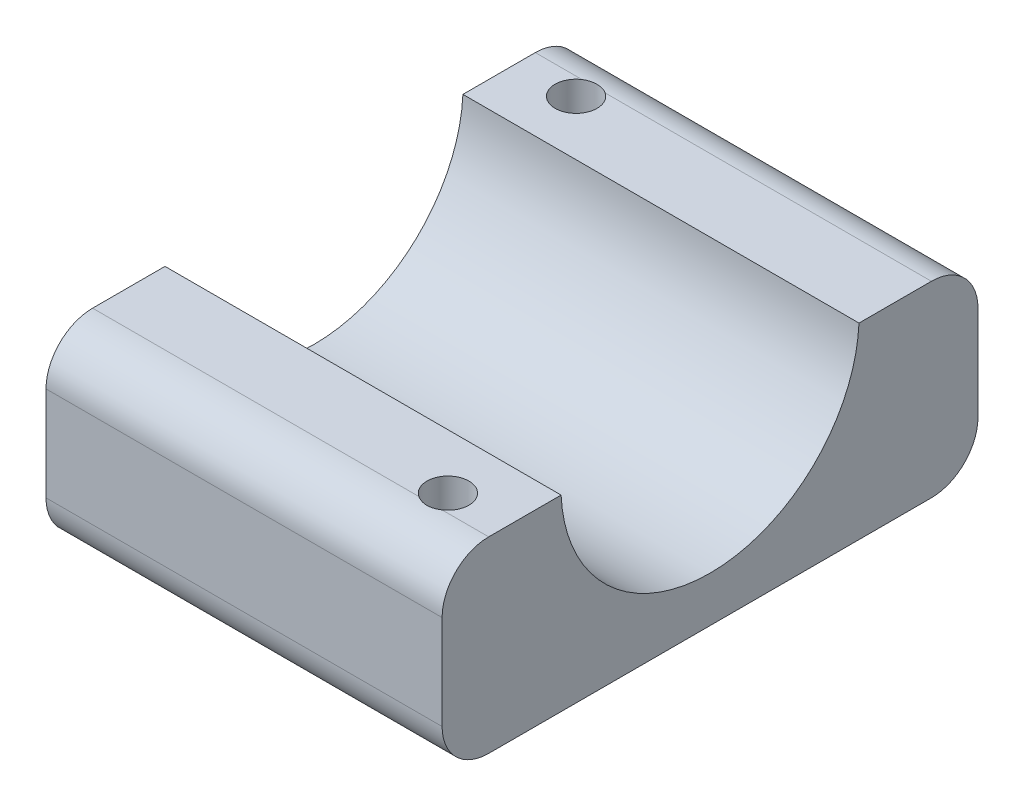
ISO-10303-21;
HEADER;
FILE_DESCRIPTION(('STEP AP214'),'2;1');
FILE_NAME('part.step','',(''),(''),'','','');
FILE_SCHEMA(('AUTOMOTIVE_DESIGN { 1 0 10303 214 1 1 1 1 }'));
ENDSEC;
DATA;
#1=APPLICATION_CONTEXT('core data for automotive mechanical design processes');
#2=APPLICATION_PROTOCOL_DEFINITION('international standard','automotive_design',2000,#1);
#3=PRODUCT_CONTEXT('',#1,'mechanical');
#4=PRODUCT('Part','Part','',(#3));
#5=PRODUCT_RELATED_PRODUCT_CATEGORY('part','',(#4));
#6=PRODUCT_DEFINITION_FORMATION('','',#4);
#7=PRODUCT_DEFINITION_CONTEXT('part definition',#1,'design');
#8=PRODUCT_DEFINITION('design','',#6,#7);
#9=PRODUCT_DEFINITION_SHAPE('','',#8);
#10=(LENGTH_UNIT() NAMED_UNIT(*) SI_UNIT(.MILLI.,.METRE.));
#11=(NAMED_UNIT(*) PLANE_ANGLE_UNIT() SI_UNIT($,.RADIAN.));
#12=(NAMED_UNIT(*) SI_UNIT($,.STERADIAN.) SOLID_ANGLE_UNIT());
#13=UNCERTAINTY_MEASURE_WITH_UNIT(LENGTH_MEASURE(1.E-05),#10,'distance_accuracy_value','');
#14=(GEOMETRIC_REPRESENTATION_CONTEXT(3) GLOBAL_UNCERTAINTY_ASSIGNED_CONTEXT((#13)) GLOBAL_UNIT_ASSIGNED_CONTEXT((#10,
#11,#12)) REPRESENTATION_CONTEXT('',''));
#15=CARTESIAN_POINT('',(0.,0.,0.));
#16=DIRECTION('',(0.,0.,1.));
#17=DIRECTION('',(1.,0.,0.));
#18=AXIS2_PLACEMENT_3D('',#15,#16,#17);
#19=CARTESIAN_POINT('',(17.,-12.7,19.));
#20=DIRECTION('',(-1.,0.,0.));
#21=DIRECTION('',(0.,0.,1.));
#22=AXIS2_PLACEMENT_3D('',#19,#20,#21);
#23=CYLINDRICAL_SURFACE('',#22,4.);
#24=CARTESIAN_POINT('',(14.8831406486677,-16.7,19.));
#25=CARTESIAN_POINT('',(14.8426506773485,-16.7000109242073,19.0778574955817));
#26=CARTESIAN_POINT('',(14.799000228987,-16.6977274477931,19.1540259495156));
#27=CARTESIAN_POINT('',(14.7058465588756,-16.6892434582838,19.3023684001236));
#28=CARTESIAN_POINT('',(14.6563491198335,-16.6830467894245,19.3745462414952));
#29=CARTESIAN_POINT('',(14.5521394497937,-16.6674431467714,19.5141099444437));
#30=CARTESIAN_POINT('',(14.4974534105728,-16.6580517369091,19.5815171592083));
#31=CARTESIAN_POINT('',(14.3830963067864,-16.6367588944703,19.7115277345354));
#32=CARTESIAN_POINT('',(14.3234240657577,-16.624856868514,19.7741299546666));
#33=CARTESIAN_POINT('',(14.137958520912,-16.5865410499203,19.9538040445996));
#34=CARTESIAN_POINT('',(14.0052730523629,-16.5574402181653,20.063333735106));
#35=CARTESIAN_POINT('',(13.7244267415197,-16.4977204142456,20.2601369098951));
#36=CARTESIAN_POINT('',(13.576240301189,-16.4670989762058,20.3473727339024));
#37=CARTESIAN_POINT('',(13.2554948894781,-16.4077377901675,20.5033912591476));
#38=CARTESIAN_POINT('',(13.0819397555766,-16.3793171325302,20.5702714707651));
#39=CARTESIAN_POINT('',(12.7247230253625,-16.3334988458983,20.67360310912));
#40=CARTESIAN_POINT('',(12.541074540201,-16.3160872676328,20.7100930611152));
#41=CARTESIAN_POINT('',(12.1801211742974,-16.2970438866187,20.7497826168194));
#42=CARTESIAN_POINT('',(12.0030606959685,-16.2945604785481,20.7547796461988));
#43=CARTESIAN_POINT('',(11.6508551478767,-16.303665315988,20.7360004114565));
#44=CARTESIAN_POINT('',(11.4757100720865,-16.3152535172044,20.7122242379062));
#45=CARTESIAN_POINT('',(11.1432131791046,-16.3488250161309,20.6393688950356));
#46=CARTESIAN_POINT('',(10.9854273142967,-16.3701323340066,20.5919187162139));
#47=CARTESIAN_POINT('',(10.6795530268689,-16.4189794615007,20.4741906823131));
#48=CARTESIAN_POINT('',(10.5314732871055,-16.4465247559277,20.4038927142524));
#49=CARTESIAN_POINT('',(10.2349555579031,-16.5058026088642,20.2347450945025));
#50=CARTESIAN_POINT('',(10.0876893410615,-16.5376887696085,20.13389244722));
#51=CARTESIAN_POINT('',(9.81126908660816,-16.5970581196079,19.9090688065648));
#52=CARTESIAN_POINT('',(9.68208622636505,-16.624548325662,19.7851353533026));
#53=CARTESIAN_POINT('',(9.4767689193668,-16.6629034475965,19.5525613074241));
#54=CARTESIAN_POINT('',(9.39568604242196,-16.6762483146135,19.4486923027872));
#55=CARTESIAN_POINT('',(9.28369159763862,-16.6901621549613,19.2856467872631));
#56=CARTESIAN_POINT('',(9.24792841576943,-16.6937835167149,19.2300209908782));
#57=CARTESIAN_POINT('',(9.17979814905551,-16.6987044935031,19.1165845685182));
#58=CARTESIAN_POINT('',(9.14743311817267,-16.7000027118666,19.058772649559));
#59=CARTESIAN_POINT('',(9.1168593513323,-16.7,19.));
#60=B_SPLINE_CURVE_WITH_KNOTS('',3,(#24,#25,#26,#27,#28,#29,#30,#31,#32,#33,#34,#35,#36,#37,#38,
#39,#40,#41,#42,#43,#44,#45,#46,#47,#48,#49,#50,#51,#52,#53,#54,#55,#56,#57,#58,#59),
.UNSPECIFIED.,.F.,.F.,(4,2,2,2,2,2,2,2,2,2,2,2,2,2,2,2,2,4),(0.,0.263108350436764,
0.525958630143497,0.78754628825429,1.0491958415726,1.5702947033418,2.09226810629026,
2.65384856233941,3.21471602330402,3.74325888086913,4.27180007470835,4.76815579490835,
5.26494964749648,5.80654118475775,6.34725941618147,6.7433968577492,6.94193709517688,
7.140596654703),.UNSPECIFIED.);
#61=CARTESIAN_POINT('',(14.8831406486677,-16.7,19.));
#62=VERTEX_POINT('',#61);
#63=CARTESIAN_POINT('',(9.1168593513323,-16.7,19.));
#64=VERTEX_POINT('',#63);
#65=EDGE_CURVE('E62',#62,#64,#60,.T.);
#66=ORIENTED_EDGE('',*,*,#65,.F.);
#67=DIRECTION('',(-1.,0.,0.));
#68=VECTOR('',#67,1.);
#69=CARTESIAN_POINT('',(17.,-16.7,19.));
#70=LINE('',#69,#68);
#71=CARTESIAN_POINT('',(17.,-16.7,19.));
#72=VERTEX_POINT('',#71);
#73=EDGE_CURVE('E166',#72,#62,#70,.T.);
#74=ORIENTED_EDGE('',*,*,#73,.F.);
#75=CARTESIAN_POINT('',(17.,-12.7,19.));
#76=DIRECTION('',(1.,0.,0.));
#77=DIRECTION('',(0.,0.,-1.));
#78=AXIS2_PLACEMENT_3D('',#75,#76,#77);
#79=CIRCLE('',#78,4.);
#80=CARTESIAN_POINT('',(17.,-12.7,23.));
#81=VERTEX_POINT('',#80);
#82=EDGE_CURVE('E235',#81,#72,#79,.T.);
#83=ORIENTED_EDGE('',*,*,#82,.F.);
#84=DIRECTION('',(-1.,0.,0.));
#85=VECTOR('',#84,1.);
#86=CARTESIAN_POINT('',(17.,-12.7,23.));
#87=LINE('',#86,#85);
#88=CARTESIAN_POINT('',(-17.,-12.7,23.));
#89=VERTEX_POINT('',#88);
#90=EDGE_CURVE('E262',#81,#89,#87,.T.);
#91=ORIENTED_EDGE('',*,*,#90,.T.);
#92=CARTESIAN_POINT('',(-17.,-12.7,19.));
#93=DIRECTION('',(1.,0.,0.));
#94=DIRECTION('',(0.,0.,-1.));
#95=AXIS2_PLACEMENT_3D('',#92,#93,#94);
#96=CIRCLE('',#95,4.);
#97=CARTESIAN_POINT('',(-17.,-16.7,19.));
#98=VERTEX_POINT('',#97);
#99=EDGE_CURVE('E263',#89,#98,#96,.T.);
#100=ORIENTED_EDGE('',*,*,#99,.T.);
#101=EDGE_CURVE('E160',#64,#98,#70,.T.);
#102=ORIENTED_EDGE('',*,*,#101,.F.);
#103=EDGE_LOOP('',(#66,#74,#83,#91,#100,#102));
#104=FACE_BOUND('',#103,.T.);
#105=ADVANCED_FACE('F39',(#104),#23,.T.);
#106=CARTESIAN_POINT('',(17.,-12.7,-19.));
#107=DIRECTION('',(-1.,0.,0.));
#108=DIRECTION('',(0.,0.,1.));
#109=AXIS2_PLACEMENT_3D('',#106,#107,#108);
#110=CYLINDRICAL_SURFACE('',#109,4.);
#111=CARTESIAN_POINT('',(-14.8831406486677,-16.7,-19.));
#112=CARTESIAN_POINT('',(-14.8426506773485,-16.7000109242073,-19.0778574955817));
#113=CARTESIAN_POINT('',(-14.799000228987,-16.6977274477931,-19.1540259495156));
#114=CARTESIAN_POINT('',(-14.7058465588756,-16.6892434582838,-19.3023684001236));
#115=CARTESIAN_POINT('',(-14.6563491198335,-16.6830467894245,-19.3745462414952));
#116=CARTESIAN_POINT('',(-14.5521394497937,-16.6674431467714,-19.5141099444437));
#117=CARTESIAN_POINT('',(-14.4974534105728,-16.6580517369091,-19.5815171592083));
#118=CARTESIAN_POINT('',(-14.3830963067865,-16.6367588944703,-19.7115277345354));
#119=CARTESIAN_POINT('',(-14.3234240657577,-16.624856868514,-19.7741299546666));
#120=CARTESIAN_POINT('',(-14.137958520912,-16.5865410499203,-19.9538040445996));
#121=CARTESIAN_POINT('',(-14.0052730523629,-16.5574402181653,-20.063333735106));
#122=CARTESIAN_POINT('',(-13.7244267415197,-16.4977204142456,-20.2601369098951));
#123=CARTESIAN_POINT('',(-13.576240301189,-16.4670989762058,-20.3473727339024));
#124=CARTESIAN_POINT('',(-13.2554948894781,-16.4077377901675,-20.5033912591476));
#125=CARTESIAN_POINT('',(-13.0819397555766,-16.3793171325302,-20.5702714707651));
#126=CARTESIAN_POINT('',(-12.7247230253625,-16.3334988458983,-20.67360310912));
#127=CARTESIAN_POINT('',(-12.541074540201,-16.3160872676328,-20.7100930611152));
#128=CARTESIAN_POINT('',(-12.1801211742974,-16.2970438866187,-20.7497826168194));
#129=CARTESIAN_POINT('',(-12.0030606959685,-16.2945604785481,-20.7547796461988));
#130=CARTESIAN_POINT('',(-11.6508551478767,-16.303665315988,-20.7360004114565));
#131=CARTESIAN_POINT('',(-11.4757100720865,-16.3152535172044,-20.7122242379062));
#132=CARTESIAN_POINT('',(-11.1432131791046,-16.3488250161309,-20.6393688950356));
#133=CARTESIAN_POINT('',(-10.9854273142967,-16.3701323340066,-20.5919187162139));
#134=CARTESIAN_POINT('',(-10.6795530268689,-16.4189794615007,-20.4741906823131));
#135=CARTESIAN_POINT('',(-10.5314732871055,-16.4465247559277,-20.4038927142524));
#136=CARTESIAN_POINT('',(-10.2349555579031,-16.5058026088642,-20.2347450945025));
#137=CARTESIAN_POINT('',(-10.0876893410615,-16.5376887696085,-20.13389244722));
#138=CARTESIAN_POINT('',(-9.81126908660815,-16.5970581196079,-19.9090688065648));
#139=CARTESIAN_POINT('',(-9.68208622636505,-16.624548325662,-19.7851353533026));
#140=CARTESIAN_POINT('',(-9.4767689193668,-16.6629034475965,-19.5525613074241));
#141=CARTESIAN_POINT('',(-9.39568604242196,-16.6762483146135,-19.4486923027872));
#142=CARTESIAN_POINT('',(-9.28369159763862,-16.6901621549613,-19.2856467872631));
#143=CARTESIAN_POINT('',(-9.24792841576943,-16.6937835167149,-19.2300209908782));
#144=CARTESIAN_POINT('',(-9.17979814905551,-16.6987044935031,-19.1165845685183));
#145=CARTESIAN_POINT('',(-9.14743311817267,-16.7000027118666,-19.058772649559));
#146=CARTESIAN_POINT('',(-9.1168593513323,-16.7,-19.));
#147=B_SPLINE_CURVE_WITH_KNOTS('',3,(#111,#112,#113,#114,#115,#116,#117,#118,#119,#120,#121,
#122,#123,#124,#125,#126,#127,#128,#129,#130,#131,#132,#133,#134,#135,#136,#137,#138,#139,#140,
#141,#142,#143,#144,#145,#146),.UNSPECIFIED.,.F.,.F.,(4,2,2,2,2,2,2,2,2,2,2,2,2,2,2,2,2,4),(0.,
0.263108350436761,0.525958630143496,0.787546288254289,1.0491958415726,1.57029470334181,
2.09226810629026,2.65384856233941,3.21471602330402,3.74325888086914,4.27180007470836,
4.76815579490835,5.26494964749648,5.80654118475775,6.34725941618148,6.74339685774921,
6.94193709517688,7.140596654703),.UNSPECIFIED.);
#148=CARTESIAN_POINT('',(-14.8831406486677,-16.7,-19.));
#149=VERTEX_POINT('',#148);
#150=CARTESIAN_POINT('',(-9.1168593513323,-16.7,-19.));
#151=VERTEX_POINT('',#150);
#152=EDGE_CURVE('E55',#149,#151,#147,.T.);
#153=ORIENTED_EDGE('',*,*,#152,.F.);
#154=DIRECTION('',(-1.,0.,0.));
#155=VECTOR('',#154,1.);
#156=CARTESIAN_POINT('',(17.,-16.7,-19.));
#157=LINE('',#156,#155);
#158=CARTESIAN_POINT('',(-17.,-16.7,-19.));
#159=VERTEX_POINT('',#158);
#160=EDGE_CURVE('E149',#149,#159,#157,.T.);
#161=ORIENTED_EDGE('',*,*,#160,.T.);
#162=CARTESIAN_POINT('',(-17.,-12.7,-19.));
#163=DIRECTION('',(1.,0.,0.));
#164=DIRECTION('',(0.,0.,-1.));
#165=AXIS2_PLACEMENT_3D('',#162,#163,#164);
#166=CIRCLE('',#165,4.);
#167=CARTESIAN_POINT('',(-17.,-12.7,-23.));
#168=VERTEX_POINT('',#167);
#169=EDGE_CURVE('E266',#159,#168,#166,.T.);
#170=ORIENTED_EDGE('',*,*,#169,.T.);
#171=DIRECTION('',(-1.,0.,0.));
#172=VECTOR('',#171,1.);
#173=CARTESIAN_POINT('',(17.,-12.7,-23.));
#174=LINE('',#173,#172);
#175=CARTESIAN_POINT('',(17.,-12.7,-23.));
#176=VERTEX_POINT('',#175);
#177=EDGE_CURVE('E158',#176,#168,#174,.T.);
#178=ORIENTED_EDGE('',*,*,#177,.F.);
#179=CARTESIAN_POINT('',(17.,-12.7,-19.));
#180=DIRECTION('',(1.,0.,0.));
#181=DIRECTION('',(0.,0.,-1.));
#182=AXIS2_PLACEMENT_3D('',#179,#180,#181);
#183=CIRCLE('',#182,4.);
#184=CARTESIAN_POINT('',(17.,-16.7,-19.));
#185=VERTEX_POINT('',#184);
#186=EDGE_CURVE('E234',#185,#176,#183,.T.);
#187=ORIENTED_EDGE('',*,*,#186,.F.);
#188=EDGE_CURVE('E152',#185,#151,#157,.T.);
#189=ORIENTED_EDGE('',*,*,#188,.T.);
#190=EDGE_LOOP('',(#153,#161,#170,#178,#187,#189));
#191=FACE_BOUND('',#190,.T.);
#192=ADVANCED_FACE('F148',(#191),#110,.T.);
#193=CARTESIAN_POINT('',(17.,-4.6,-19.));
#194=DIRECTION('',(-1.,0.,0.));
#195=DIRECTION('',(0.,0.,1.));
#196=AXIS2_PLACEMENT_3D('',#193,#194,#195);
#197=CYLINDRICAL_SURFACE('',#196,4.);
#198=CARTESIAN_POINT('',(-11.0050125628934,-0.6,-19.));
#199=CARTESIAN_POINT('',(-11.0471919494141,-0.600002290201008,-19.0279782687762));
#200=CARTESIAN_POINT('',(-11.0905300624338,-0.600293109258532,-19.054162436945));
#201=CARTESIAN_POINT('',(-11.1792493356974,-0.601246630542694,-19.1027880961604));
#202=CARTESIAN_POINT('',(-11.224630336906,-0.601909303866988,-19.1252298779078));
#203=CARTESIAN_POINT('',(-11.3632919534806,-0.60414515604213,-19.1866521635867));
#204=CARTESIAN_POINT('',(-11.4592244258047,-0.605967454515857,-19.2198177956695));
#205=CARTESIAN_POINT('',(-11.6552891209815,-0.609016111648687,-19.2695824039112));
#206=CARTESIAN_POINT('',(-11.7554228470139,-0.610242254997947,-19.2861753969049));
#207=CARTESIAN_POINT('',(-11.9570747060166,-0.611432977587128,-19.3023260095373));
#208=CARTESIAN_POINT('',(-12.0585927592301,-0.611397629202323,-19.3018846064864));
#209=CARTESIAN_POINT('',(-12.2599850427663,-0.610084395953699,-19.2839916011113));
#210=CARTESIAN_POINT('',(-12.3598608656075,-0.608807797075412,-19.266557603754));
#211=CARTESIAN_POINT('',(-12.555237018111,-0.605710678825216,-19.2151942389305));
#212=CARTESIAN_POINT('',(-12.6507408400042,-0.603890602630139,-19.181278297527));
#213=CARTESIAN_POINT('',(-12.7865371051718,-0.601745422922836,-19.1197807652606));
#214=CARTESIAN_POINT('',(-12.8296054345031,-0.601136078493984,-19.0981480345368));
#215=CARTESIAN_POINT('',(-12.9137908330242,-0.600264553601652,-19.0515455180329));
#216=CARTESIAN_POINT('',(-12.9549115439312,-0.600001698383489,-19.0265823227808));
#217=CARTESIAN_POINT('',(-12.9949874371066,-0.6,-19.));
#218=B_SPLINE_CURVE_WITH_KNOTS('',3,(#198,#199,#200,#201,#202,#203,#204,#205,#206,#207,#208,
#209,#210,#211,#212,#213,#214,#215,#216,#217),.UNSPECIFIED.,.F.,.F.,(4,2,2,2,2,2,2,2,2,4),(0.,
0.151748564164442,0.30348533531734,0.606485618853393,0.909595254081968,1.21268749909945,
1.51546606256915,1.81799839737315,1.96246492195647,2.10664969408635),.UNSPECIFIED.);
#219=CARTESIAN_POINT('',(-11.0050125628934,-0.6,-19.));
#220=VERTEX_POINT('',#219);
#221=CARTESIAN_POINT('',(-12.9949874371066,-0.6,-19.));
#222=VERTEX_POINT('',#221);
#223=EDGE_CURVE('E11',#220,#222,#218,.T.);
#224=ORIENTED_EDGE('',*,*,#223,.F.);
#225=DIRECTION('',(-1.,0.,0.));
#226=VECTOR('',#225,1.);
#227=CARTESIAN_POINT('',(17.,-0.6,-19.));
#228=LINE('',#227,#226);
#229=CARTESIAN_POINT('',(17.,-0.6,-19.));
#230=VERTEX_POINT('',#229);
#231=EDGE_CURVE('E287',#230,#220,#228,.T.);
#232=ORIENTED_EDGE('',*,*,#231,.F.);
#233=CARTESIAN_POINT('',(17.,-4.6,-19.));
#234=DIRECTION('',(1.,0.,0.));
#235=DIRECTION('',(0.,0.,-1.));
#236=AXIS2_PLACEMENT_3D('',#233,#234,#235);
#237=CIRCLE('',#236,4.);
#238=CARTESIAN_POINT('',(17.,-4.6,-23.));
#239=VERTEX_POINT('',#238);
#240=EDGE_CURVE('E253',#239,#230,#237,.T.);
#241=ORIENTED_EDGE('',*,*,#240,.F.);
#242=DIRECTION('',(-1.,0.,0.));
#243=VECTOR('',#242,1.);
#244=CARTESIAN_POINT('',(17.,-4.6,-23.));
#245=LINE('',#244,#243);
#246=CARTESIAN_POINT('',(-17.,-4.6,-23.));
#247=VERTEX_POINT('',#246);
#248=EDGE_CURVE('E162',#239,#247,#245,.T.);
#249=ORIENTED_EDGE('',*,*,#248,.T.);
#250=CARTESIAN_POINT('',(-17.,-4.6,-19.));
#251=DIRECTION('',(1.,0.,0.));
#252=DIRECTION('',(0.,0.,-1.));
#253=AXIS2_PLACEMENT_3D('',#250,#251,#252);
#254=CIRCLE('',#253,4.);
#255=CARTESIAN_POINT('',(-17.,-0.6,-19.));
#256=VERTEX_POINT('',#255);
#257=EDGE_CURVE('E270',#247,#256,#254,.T.);
#258=ORIENTED_EDGE('',*,*,#257,.T.);
#259=EDGE_CURVE('E286',#222,#256,#228,.T.);
#260=ORIENTED_EDGE('',*,*,#259,.F.);
#261=EDGE_LOOP('',(#224,#232,#241,#249,#258,#260));
#262=FACE_BOUND('',#261,.T.);
#263=ADVANCED_FACE('F224',(#262),#197,.T.);
#264=CARTESIAN_POINT('',(17.,-4.6,19.));
#265=DIRECTION('',(-1.,0.,0.));
#266=DIRECTION('',(0.,0.,1.));
#267=AXIS2_PLACEMENT_3D('',#264,#265,#266);
#268=CYLINDRICAL_SURFACE('',#267,4.);
#269=CARTESIAN_POINT('',(11.0050125628934,-0.6,19.));
#270=CARTESIAN_POINT('',(11.0471919494141,-0.600002290201008,19.0279782687762));
#271=CARTESIAN_POINT('',(11.0905300624338,-0.600293109258532,19.054162436945));
#272=CARTESIAN_POINT('',(11.1792493356974,-0.601246630542694,19.1027880961604));
#273=CARTESIAN_POINT('',(11.224630336906,-0.601909303866988,19.1252298779078));
#274=CARTESIAN_POINT('',(11.3632919534806,-0.60414515604213,19.1866521635867));
#275=CARTESIAN_POINT('',(11.4592244258047,-0.605967454515857,19.2198177956695));
#276=CARTESIAN_POINT('',(11.6552891209815,-0.609016111648687,19.2695824039112));
#277=CARTESIAN_POINT('',(11.7554228470139,-0.610242254997947,19.2861753969049));
#278=CARTESIAN_POINT('',(11.9570747060166,-0.611432977587128,19.3023260095373));
#279=CARTESIAN_POINT('',(12.0585927592301,-0.611397629202323,19.3018846064864));
#280=CARTESIAN_POINT('',(12.2599850427663,-0.610084395953699,19.2839916011113));
#281=CARTESIAN_POINT('',(12.3598608656075,-0.608807797075412,19.266557603754));
#282=CARTESIAN_POINT('',(12.555237018111,-0.605710678825216,19.2151942389305));
#283=CARTESIAN_POINT('',(12.6507408400042,-0.603890602630139,19.181278297527));
#284=CARTESIAN_POINT('',(12.7865371051718,-0.601745422922836,19.1197807652606));
#285=CARTESIAN_POINT('',(12.8296054345031,-0.601136078493984,19.0981480345368));
#286=CARTESIAN_POINT('',(12.9137908330242,-0.600264553601652,19.0515455180329));
#287=CARTESIAN_POINT('',(12.9549115439312,-0.600001698383489,19.0265823227808));
#288=CARTESIAN_POINT('',(12.9949874371066,-0.6,19.));
#289=B_SPLINE_CURVE_WITH_KNOTS('',3,(#269,#270,#271,#272,#273,#274,#275,#276,#277,#278,#279,
#280,#281,#282,#283,#284,#285,#286,#287,#288),.UNSPECIFIED.,.F.,.F.,(4,2,2,2,2,2,2,2,2,4),(0.,
0.151748564164442,0.30348533531734,0.606485618853393,0.909595254081968,1.21268749909945,
1.51546606256915,1.81799839737315,1.96246492195647,2.10664969408635),.UNSPECIFIED.);
#290=CARTESIAN_POINT('',(11.0050125628934,-0.6,19.));
#291=VERTEX_POINT('',#290);
#292=CARTESIAN_POINT('',(12.9949874371066,-0.6,19.));
#293=VERTEX_POINT('',#292);
#294=EDGE_CURVE('E48',#291,#293,#289,.T.);
#295=ORIENTED_EDGE('',*,*,#294,.F.);
#296=DIRECTION('',(-1.,0.,0.));
#297=VECTOR('',#296,1.);
#298=CARTESIAN_POINT('',(17.,-0.6,19.));
#299=LINE('',#298,#297);
#300=CARTESIAN_POINT('',(-17.,-0.6,19.));
#301=VERTEX_POINT('',#300);
#302=EDGE_CURVE('E282',#291,#301,#299,.T.);
#303=ORIENTED_EDGE('',*,*,#302,.T.);
#304=CARTESIAN_POINT('',(-17.,-4.6,19.));
#305=DIRECTION('',(1.,0.,0.));
#306=DIRECTION('',(0.,0.,-1.));
#307=AXIS2_PLACEMENT_3D('',#304,#305,#306);
#308=CIRCLE('',#307,4.);
#309=CARTESIAN_POINT('',(-17.,-4.6,23.));
#310=VERTEX_POINT('',#309);
#311=EDGE_CURVE('E244',#301,#310,#308,.T.);
#312=ORIENTED_EDGE('',*,*,#311,.T.);
#313=DIRECTION('',(-1.,0.,0.));
#314=VECTOR('',#313,1.);
#315=CARTESIAN_POINT('',(17.,-4.6,23.));
#316=LINE('',#315,#314);
#317=CARTESIAN_POINT('',(17.,-4.6,23.));
#318=VERTEX_POINT('',#317);
#319=EDGE_CURVE('E279',#318,#310,#316,.T.);
#320=ORIENTED_EDGE('',*,*,#319,.F.);
#321=CARTESIAN_POINT('',(17.,-4.6,19.));
#322=DIRECTION('',(1.,0.,0.));
#323=DIRECTION('',(0.,0.,-1.));
#324=AXIS2_PLACEMENT_3D('',#321,#322,#323);
#325=CIRCLE('',#324,4.);
#326=CARTESIAN_POINT('',(17.,-0.6,19.));
#327=VERTEX_POINT('',#326);
#328=EDGE_CURVE('E259',#327,#318,#325,.T.);
#329=ORIENTED_EDGE('',*,*,#328,.F.);
#330=EDGE_CURVE('E283',#327,#293,#299,.T.);
#331=ORIENTED_EDGE('',*,*,#330,.T.);
#332=EDGE_LOOP('',(#295,#303,#312,#320,#329,#331));
#333=FACE_BOUND('',#332,.T.);
#334=ADVANCED_FACE('F181',(#333),#268,.T.);
#335=CARTESIAN_POINT('',(17.,-0.6,-19.));
#336=DIRECTION('',(0.,-1.,0.));
#337=DIRECTION('',(0.,0.,-1.));
#338=AXIS2_PLACEMENT_3D('',#335,#336,#337);
#339=PLANE('',#338);
#340=CARTESIAN_POINT('',(-12.,-0.6,-17.5));
#341=DIRECTION('',(0.,-1.,0.));
#342=DIRECTION('',(0.,0.,-1.));
#343=AXIS2_PLACEMENT_3D('',#340,#341,#342);
#344=CIRCLE('',#343,1.8);
#345=EDGE_CURVE('E308',#222,#220,#344,.F.);
#346=ORIENTED_EDGE('',*,*,#345,.F.);
#347=ORIENTED_EDGE('',*,*,#259,.T.);
#348=DIRECTION('',(0.,0.,1.));
#349=VECTOR('',#348,1.);
#350=CARTESIAN_POINT('',(-17.,-0.6,-19.));
#351=LINE('',#350,#349);
#352=CARTESIAN_POINT('',(-17.,-0.6,-12.7859297667397));
#353=VERTEX_POINT('',#352);
#354=EDGE_CURVE('E274',#256,#353,#351,.T.);
#355=ORIENTED_EDGE('',*,*,#354,.T.);
#356=DIRECTION('',(1.,0.,0.));
#357=VECTOR('',#356,1.);
#358=CARTESIAN_POINT('',(-17.,-0.6,-12.7859297667397));
#359=LINE('',#358,#357);
#360=CARTESIAN_POINT('',(17.,-0.6,-12.7859297667397));
#361=VERTEX_POINT('',#360);
#362=EDGE_CURVE('E247',#353,#361,#359,.T.);
#363=ORIENTED_EDGE('',*,*,#362,.T.);
#364=DIRECTION('',(0.,0.,1.));
#365=VECTOR('',#364,1.);
#366=CARTESIAN_POINT('',(17.,-0.6,-19.));
#367=LINE('',#366,#365);
#368=EDGE_CURVE('E256',#230,#361,#367,.T.);
#369=ORIENTED_EDGE('',*,*,#368,.F.);
#370=ORIENTED_EDGE('',*,*,#231,.T.);
#371=EDGE_LOOP('',(#346,#347,#355,#363,#369,#370));
#372=FACE_BOUND('',#371,.T.);
#373=ADVANCED_FACE('F218',(#372),#339,.F.);
#374=CARTESIAN_POINT('',(17.,-16.7,19.));
#375=DIRECTION('',(0.,1.,0.));
#376=DIRECTION('',(0.,0.,1.));
#377=AXIS2_PLACEMENT_3D('',#374,#375,#376);
#378=PLANE('',#377);
#379=CARTESIAN_POINT('',(12.,-16.7,17.5));
#380=DIRECTION('',(0.,1.,0.));
#381=DIRECTION('',(0.,0.,1.));
#382=AXIS2_PLACEMENT_3D('',#379,#380,#381);
#383=CIRCLE('',#382,3.25);
#384=EDGE_CURVE('E144',#62,#64,#383,.T.);
#385=ORIENTED_EDGE('',*,*,#384,.T.);
#386=ORIENTED_EDGE('',*,*,#101,.T.);
#387=DIRECTION('',(0.,0.,-1.));
#388=VECTOR('',#387,1.);
#389=CARTESIAN_POINT('',(-17.,-16.7,19.));
#390=LINE('',#389,#388);
#391=EDGE_CURVE('E156',#98,#159,#390,.T.);
#392=ORIENTED_EDGE('',*,*,#391,.T.);
#393=ORIENTED_EDGE('',*,*,#160,.F.);
#394=CARTESIAN_POINT('',(-12.,-16.7,-17.5));
#395=DIRECTION('',(0.,1.,0.));
#396=DIRECTION('',(0.,0.,1.));
#397=AXIS2_PLACEMENT_3D('',#394,#395,#396);
#398=CIRCLE('',#397,3.25);
#399=EDGE_CURVE('E138',#149,#151,#398,.T.);
#400=ORIENTED_EDGE('',*,*,#399,.T.);
#401=ORIENTED_EDGE('',*,*,#188,.F.);
#402=DIRECTION('',(0.,0.,-1.));
#403=VECTOR('',#402,1.);
#404=CARTESIAN_POINT('',(17.,-16.7,19.));
#405=LINE('',#404,#403);
#406=EDGE_CURVE('E232',#72,#185,#405,.T.);
#407=ORIENTED_EDGE('',*,*,#406,.F.);
#408=ORIENTED_EDGE('',*,*,#73,.T.);
#409=EDGE_LOOP('',(#385,#386,#392,#393,#400,#401,#407,#408));
#410=FACE_BOUND('',#409,.T.);
#411=ADVANCED_FACE('F154',(#410),#378,.F.);
#412=CARTESIAN_POINT('',(17.,-12.7,-23.));
#413=DIRECTION('',(0.,0.,1.));
#414=DIRECTION('',(1.,0.,0.));
#415=AXIS2_PLACEMENT_3D('',#412,#413,#414);
#416=PLANE('',#415);
#417=DIRECTION('',(0.,1.,0.));
#418=VECTOR('',#417,1.);
#419=CARTESIAN_POINT('',(-17.,-12.7,-23.));
#420=LINE('',#419,#418);
#421=EDGE_CURVE('E268',#168,#247,#420,.T.);
#422=ORIENTED_EDGE('',*,*,#421,.T.);
#423=ORIENTED_EDGE('',*,*,#248,.F.);
#424=DIRECTION('',(0.,1.,0.));
#425=VECTOR('',#424,1.);
#426=CARTESIAN_POINT('',(17.,-12.7,-23.));
#427=LINE('',#426,#425);
#428=EDGE_CURVE('E251',#176,#239,#427,.T.);
#429=ORIENTED_EDGE('',*,*,#428,.F.);
#430=ORIENTED_EDGE('',*,*,#177,.T.);
#431=EDGE_LOOP('',(#422,#423,#429,#430));
#432=FACE_BOUND('',#431,.T.);
#433=ADVANCED_FACE('F216',(#432),#416,.F.);
#434=CARTESIAN_POINT('',(12.,-0.6,17.5));
#435=DIRECTION('',(0.,-1.,0.));
#436=DIRECTION('',(0.,0.,-1.));
#437=AXIS2_PLACEMENT_3D('',#434,#435,#436);
#438=CIRCLE('',#437,1.8);
#439=EDGE_CURVE('E230',#293,#291,#438,.F.);
#440=ORIENTED_EDGE('',*,*,#439,.F.);
#441=ORIENTED_EDGE('',*,*,#330,.F.);
#442=CARTESIAN_POINT('',(17.,-0.6,12.7859297667397));
#443=VERTEX_POINT('',#442);
#444=EDGE_CURVE('E255',#443,#327,#367,.T.);
#445=ORIENTED_EDGE('',*,*,#444,.F.);
#446=DIRECTION('',(1.,0.,0.));
#447=VECTOR('',#446,1.);
#448=CARTESIAN_POINT('',(-17.,-0.6,12.7859297667397));
#449=LINE('',#448,#447);
#450=CARTESIAN_POINT('',(-17.,-0.6,12.7859297667397));
#451=VERTEX_POINT('',#450);
#452=EDGE_CURVE('E324',#443,#451,#449,.F.);
#453=ORIENTED_EDGE('',*,*,#452,.T.);
#454=EDGE_CURVE('E273',#451,#301,#351,.T.);
#455=ORIENTED_EDGE('',*,*,#454,.T.);
#456=ORIENTED_EDGE('',*,*,#302,.F.);
#457=EDGE_LOOP('',(#440,#441,#445,#453,#455,#456));
#458=FACE_BOUND('',#457,.T.);
#459=ADVANCED_FACE('F210',(#458),#339,.F.);
#460=CARTESIAN_POINT('',(17.,-4.6,23.));
#461=DIRECTION('',(0.,0.,-1.));
#462=DIRECTION('',(-1.,0.,0.));
#463=AXIS2_PLACEMENT_3D('',#460,#461,#462);
#464=PLANE('',#463);
#465=DIRECTION('',(0.,-1.,0.));
#466=VECTOR('',#465,1.);
#467=CARTESIAN_POINT('',(-17.,-4.6,23.));
#468=LINE('',#467,#466);
#469=EDGE_CURVE('E242',#310,#89,#468,.T.);
#470=ORIENTED_EDGE('',*,*,#469,.T.);
#471=ORIENTED_EDGE('',*,*,#90,.F.);
#472=DIRECTION('',(0.,-1.,0.));
#473=VECTOR('',#472,1.);
#474=CARTESIAN_POINT('',(17.,-4.6,23.));
#475=LINE('',#474,#473);
#476=EDGE_CURVE('E239',#318,#81,#475,.T.);
#477=ORIENTED_EDGE('',*,*,#476,.F.);
#478=ORIENTED_EDGE('',*,*,#319,.T.);
#479=EDGE_LOOP('',(#470,#471,#477,#478));
#480=FACE_BOUND('',#479,.T.);
#481=ADVANCED_FACE('F205',(#480),#464,.F.);
#482=CARTESIAN_POINT('',(17.,-12.7,19.));
#483=DIRECTION('',(1.,0.,0.));
#484=DIRECTION('',(0.,0.,-1.));
#485=AXIS2_PLACEMENT_3D('',#482,#483,#484);
#486=PLANE('',#485);
#487=CARTESIAN_POINT('',(17.,0.,0.));
#488=DIRECTION('',(1.,0.,0.));
#489=DIRECTION('',(0.,0.,-1.));
#490=AXIS2_PLACEMENT_3D('',#487,#488,#489);
#491=CIRCLE('',#490,12.8);
#492=EDGE_CURVE('E310',#443,#361,#491,.T.);
#493=ORIENTED_EDGE('',*,*,#492,.F.);
#494=ORIENTED_EDGE('',*,*,#444,.T.);
#495=ORIENTED_EDGE('',*,*,#328,.T.);
#496=ORIENTED_EDGE('',*,*,#476,.T.);
#497=ORIENTED_EDGE('',*,*,#82,.T.);
#498=ORIENTED_EDGE('',*,*,#406,.T.);
#499=ORIENTED_EDGE('',*,*,#186,.T.);
#500=ORIENTED_EDGE('',*,*,#428,.T.);
#501=ORIENTED_EDGE('',*,*,#240,.T.);
#502=ORIENTED_EDGE('',*,*,#368,.T.);
#503=EDGE_LOOP('',(#493,#494,#495,#496,#497,#498,#499,#500,#501,#502));
#504=FACE_BOUND('',#503,.T.);
#505=ADVANCED_FACE('F202',(#504),#486,.T.);
#506=CARTESIAN_POINT('',(-17.,-12.7,19.));
#507=DIRECTION('',(1.,0.,0.));
#508=DIRECTION('',(0.,0.,-1.));
#509=AXIS2_PLACEMENT_3D('',#506,#507,#508);
#510=PLANE('',#509);
#511=ORIENTED_EDGE('',*,*,#454,.F.);
#512=CARTESIAN_POINT('',(-17.,0.,0.));
#513=DIRECTION('',(1.,0.,0.));
#514=DIRECTION('',(0.,0.,-1.));
#515=AXIS2_PLACEMENT_3D('',#512,#513,#514);
#516=CIRCLE('',#515,12.8);
#517=EDGE_CURVE('E303',#451,#353,#516,.T.);
#518=ORIENTED_EDGE('',*,*,#517,.T.);
#519=ORIENTED_EDGE('',*,*,#354,.F.);
#520=ORIENTED_EDGE('',*,*,#257,.F.);
#521=ORIENTED_EDGE('',*,*,#421,.F.);
#522=ORIENTED_EDGE('',*,*,#169,.F.);
#523=ORIENTED_EDGE('',*,*,#391,.F.);
#524=ORIENTED_EDGE('',*,*,#99,.F.);
#525=ORIENTED_EDGE('',*,*,#469,.F.);
#526=ORIENTED_EDGE('',*,*,#311,.F.);
#527=EDGE_LOOP('',(#511,#518,#519,#520,#521,#522,#523,#524,#525,#526));
#528=FACE_BOUND('',#527,.T.);
#529=ADVANCED_FACE('F200',(#528),#510,.F.);
#530=CARTESIAN_POINT('',(-17.,0.,0.));
#531=DIRECTION('',(1.,0.,0.));
#532=DIRECTION('',(0.,0.,-1.));
#533=AXIS2_PLACEMENT_3D('',#530,#531,#532);
#534=CYLINDRICAL_SURFACE('',#533,12.8);
#535=ORIENTED_EDGE('',*,*,#517,.F.);
#536=ORIENTED_EDGE('',*,*,#452,.F.);
#537=ORIENTED_EDGE('',*,*,#492,.T.);
#538=ORIENTED_EDGE('',*,*,#362,.F.);
#539=EDGE_LOOP('',(#535,#536,#537,#538));
#540=FACE_BOUND('',#539,.T.);
#541=ADVANCED_FACE('F190',(#540),#534,.F.);
#542=CARTESIAN_POINT('',(12.,0.300000000000002,17.5));
#543=DIRECTION('',(0.,-1.,0.));
#544=DIRECTION('',(0.,0.,-1.));
#545=AXIS2_PLACEMENT_3D('',#542,#543,#544);
#546=CYLINDRICAL_SURFACE('',#545,1.8);
#547=CARTESIAN_POINT('',(12.,-12.4,17.5));
#548=DIRECTION('',(0.,1.,0.));
#549=DIRECTION('',(0.,0.,1.));
#550=AXIS2_PLACEMENT_3D('',#547,#548,#549);
#551=CIRCLE('',#550,1.8);
#552=CARTESIAN_POINT('',(12.,-12.4,19.3));
#553=VERTEX_POINT('',#552);
#554=EDGE_CURVE('E43',#553,#553,#551,.T.);
#555=ORIENTED_EDGE('',*,*,#554,.F.);
#556=EDGE_LOOP('',(#555));
#557=FACE_BOUND('',#556,.T.);
#558=ORIENTED_EDGE('',*,*,#439,.T.);
#559=ORIENTED_EDGE('',*,*,#294,.T.);
#560=EDGE_LOOP('',(#558,#559));
#561=FACE_BOUND('',#560,.T.);
#562=ADVANCED_FACE('F185',(#557,#561),#546,.F.);
#563=CARTESIAN_POINT('',(-12.,0.300000000000002,-17.5));
#564=DIRECTION('',(0.,-1.,0.));
#565=DIRECTION('',(0.,0.,-1.));
#566=AXIS2_PLACEMENT_3D('',#563,#564,#565);
#567=CYLINDRICAL_SURFACE('',#566,1.8);
#568=CARTESIAN_POINT('',(-12.,-12.4,-17.5));
#569=DIRECTION('',(0.,1.,0.));
#570=DIRECTION('',(0.,0.,1.));
#571=AXIS2_PLACEMENT_3D('',#568,#569,#570);
#572=CIRCLE('',#571,1.8);
#573=CARTESIAN_POINT('',(-12.,-12.4,-15.7));
#574=VERTEX_POINT('',#573);
#575=EDGE_CURVE('E360',#574,#574,#572,.T.);
#576=ORIENTED_EDGE('',*,*,#575,.F.);
#577=EDGE_LOOP('',(#576));
#578=FACE_BOUND('',#577,.T.);
#579=ORIENTED_EDGE('',*,*,#345,.T.);
#580=ORIENTED_EDGE('',*,*,#223,.T.);
#581=EDGE_LOOP('',(#579,#580));
#582=FACE_BOUND('',#581,.T.);
#583=ADVANCED_FACE('F189',(#578,#582),#567,.F.);
#584=CARTESIAN_POINT('',(-12.,-12.4,-17.5));
#585=DIRECTION('',(0.,-1.,0.));
#586=DIRECTION('',(0.,0.,-1.));
#587=AXIS2_PLACEMENT_3D('',#584,#585,#586);
#588=CYLINDRICAL_SURFACE('',#587,3.25);
#589=CARTESIAN_POINT('',(-12.,-12.4,-17.5));
#590=DIRECTION('',(0.,1.,0.));
#591=DIRECTION('',(0.,0.,1.));
#592=AXIS2_PLACEMENT_3D('',#589,#590,#591);
#593=CIRCLE('',#592,3.25);
#594=CARTESIAN_POINT('',(-12.,-12.4,-14.25));
#595=VERTEX_POINT('',#594);
#596=EDGE_CURVE('E145',#595,#595,#593,.T.);
#597=ORIENTED_EDGE('',*,*,#596,.T.);
#598=EDGE_LOOP('',(#597));
#599=FACE_BOUND('',#598,.T.);
#600=ORIENTED_EDGE('',*,*,#152,.T.);
#601=ORIENTED_EDGE('',*,*,#399,.F.);
#602=EDGE_LOOP('',(#600,#601));
#603=FACE_BOUND('',#602,.T.);
#604=ADVANCED_FACE('F139',(#599,#603),#588,.F.);
#605=CARTESIAN_POINT('',(-12.,-12.4,-17.5));
#606=DIRECTION('',(0.,1.,0.));
#607=DIRECTION('',(0.,0.,1.));
#608=AXIS2_PLACEMENT_3D('',#605,#606,#607);
#609=PLANE('',#608);
#610=ORIENTED_EDGE('',*,*,#575,.T.);
#611=EDGE_LOOP('',(#610));
#612=FACE_BOUND('',#611,.T.);
#613=ORIENTED_EDGE('',*,*,#596,.F.);
#614=EDGE_LOOP('',(#613));
#615=FACE_BOUND('',#614,.T.);
#616=ADVANCED_FACE('F192',(#612,#615),#609,.F.);
#617=CARTESIAN_POINT('',(12.,-12.4,17.5));
#618=DIRECTION('',(0.,-1.,0.));
#619=DIRECTION('',(0.,0.,-1.));
#620=AXIS2_PLACEMENT_3D('',#617,#618,#619);
#621=CYLINDRICAL_SURFACE('',#620,3.25);
#622=CARTESIAN_POINT('',(12.,-12.4,17.5));
#623=DIRECTION('',(0.,1.,0.));
#624=DIRECTION('',(0.,0.,1.));
#625=AXIS2_PLACEMENT_3D('',#622,#623,#624);
#626=CIRCLE('',#625,3.25);
#627=CARTESIAN_POINT('',(12.,-12.4,20.75));
#628=VERTEX_POINT('',#627);
#629=EDGE_CURVE('E358',#628,#628,#626,.T.);
#630=ORIENTED_EDGE('',*,*,#629,.T.);
#631=EDGE_LOOP('',(#630));
#632=FACE_BOUND('',#631,.T.);
#633=ORIENTED_EDGE('',*,*,#65,.T.);
#634=ORIENTED_EDGE('',*,*,#384,.F.);
#635=EDGE_LOOP('',(#633,#634));
#636=FACE_BOUND('',#635,.T.);
#637=ADVANCED_FACE('F340',(#632,#636),#621,.F.);
#638=CARTESIAN_POINT('',(12.,-12.4,17.5));
#639=DIRECTION('',(0.,1.,0.));
#640=DIRECTION('',(0.,0.,1.));
#641=AXIS2_PLACEMENT_3D('',#638,#639,#640);
#642=PLANE('',#641);
#643=ORIENTED_EDGE('',*,*,#554,.T.);
#644=EDGE_LOOP('',(#643));
#645=FACE_BOUND('',#644,.T.);
#646=ORIENTED_EDGE('',*,*,#629,.F.);
#647=EDGE_LOOP('',(#646));
#648=FACE_BOUND('',#647,.T.);
#649=ADVANCED_FACE('F344',(#645,#648),#642,.F.);
#650=CLOSED_SHELL('',(#105,#192,#263,#334,#373,#411,#433,#459,#481,#505,#529,#541,#562,#583,
#604,#616,#637,#649));
#651=MANIFOLD_SOLID_BREP('B2',#650);
#652=ADVANCED_BREP_SHAPE_REPRESENTATION('',(#18,#651),#14);
#653=SHAPE_DEFINITION_REPRESENTATION(#9,#652);
ENDSEC;
END-ISO-10303-21;
